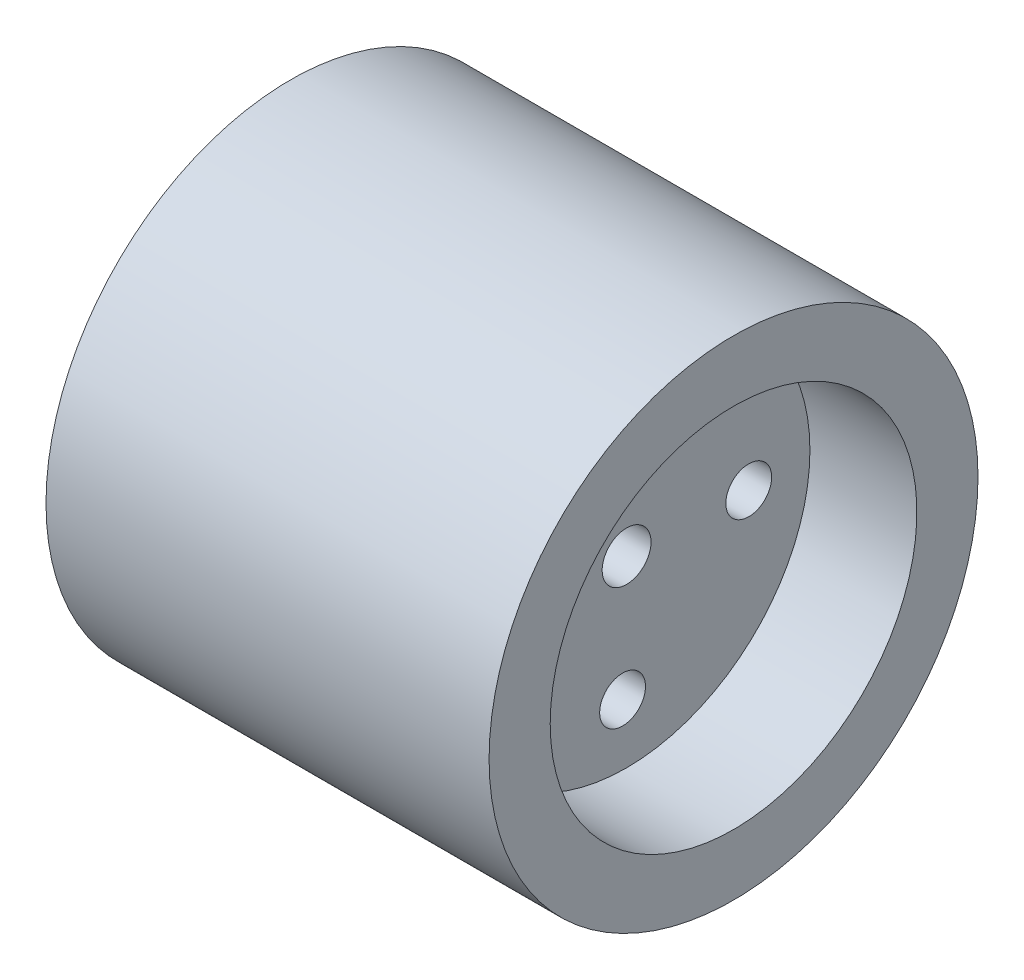
ISO-10303-21;
HEADER;
FILE_DESCRIPTION(('STEP AP214'),'2;1');
FILE_NAME('part.step','',(''),(''),'','','');
FILE_SCHEMA(('AUTOMOTIVE_DESIGN { 1 0 10303 214 1 1 1 1 }'));
ENDSEC;
DATA;
#1=APPLICATION_CONTEXT('core data for automotive mechanical design processes');
#2=APPLICATION_PROTOCOL_DEFINITION('international standard','automotive_design',2000,#1);
#3=PRODUCT_CONTEXT('',#1,'mechanical');
#4=PRODUCT('Part','Part','',(#3));
#5=PRODUCT_RELATED_PRODUCT_CATEGORY('part','',(#4));
#6=PRODUCT_DEFINITION_FORMATION('','',#4);
#7=PRODUCT_DEFINITION_CONTEXT('part definition',#1,'design');
#8=PRODUCT_DEFINITION('design','',#6,#7);
#9=PRODUCT_DEFINITION_SHAPE('','',#8);
#10=(LENGTH_UNIT() NAMED_UNIT(*) SI_UNIT(.MILLI.,.METRE.));
#11=(NAMED_UNIT(*) PLANE_ANGLE_UNIT() SI_UNIT($,.RADIAN.));
#12=(NAMED_UNIT(*) SI_UNIT($,.STERADIAN.) SOLID_ANGLE_UNIT());
#13=UNCERTAINTY_MEASURE_WITH_UNIT(LENGTH_MEASURE(1.E-05),#10,'distance_accuracy_value','');
#14=(GEOMETRIC_REPRESENTATION_CONTEXT(3) GLOBAL_UNCERTAINTY_ASSIGNED_CONTEXT((#13)) GLOBAL_UNIT_ASSIGNED_CONTEXT((#10,
#11,#12)) REPRESENTATION_CONTEXT('',''));
#15=CARTESIAN_POINT('',(0.,0.,0.));
#16=DIRECTION('',(0.,0.,1.));
#17=DIRECTION('',(1.,0.,0.));
#18=AXIS2_PLACEMENT_3D('',#15,#16,#17);
#19=CARTESIAN_POINT('',(-7.,13.,0.));
#20=DIRECTION('',(1.,0.,0.));
#21=DIRECTION('',(0.,0.,-1.));
#22=AXIS2_PLACEMENT_3D('',#19,#20,#21);
#23=PLANE('',#22);
#24=CARTESIAN_POINT('',(-7.,-7.99568996871481,0.262567942051866));
#25=DIRECTION('',(-1.,0.,0.));
#26=DIRECTION('',(0.,0.,1.));
#27=AXIS2_PLACEMENT_3D('',#24,#25,#26);
#28=CIRCLE('',#27,1.5);
#29=CARTESIAN_POINT('',(-7.,-7.99568996871481,1.76256794205187));
#30=VERTEX_POINT('',#29);
#31=EDGE_CURVE('E54',#30,#30,#28,.T.);
#32=ORIENTED_EDGE('',*,*,#31,.F.);
#33=EDGE_LOOP('',(#32));
#34=FACE_BOUND('',#33,.T.);
#35=CARTESIAN_POINT('',(-7.,-0.262567942051867,-7.99568996871481));
#36=DIRECTION('',(-1.,0.,0.));
#37=DIRECTION('',(0.,0.,1.));
#38=AXIS2_PLACEMENT_3D('',#35,#36,#37);
#39=CIRCLE('',#38,1.5);
#40=CARTESIAN_POINT('',(-7.,-0.262567942051867,-6.49568996871481));
#41=VERTEX_POINT('',#40);
#42=EDGE_CURVE('E62',#41,#41,#39,.T.);
#43=ORIENTED_EDGE('',*,*,#42,.F.);
#44=EDGE_LOOP('',(#43));
#45=FACE_BOUND('',#44,.T.);
#46=CARTESIAN_POINT('',(-7.,7.99568996871481,-0.262567942051867));
#47=DIRECTION('',(-1.,0.,0.));
#48=DIRECTION('',(0.,0.,1.));
#49=AXIS2_PLACEMENT_3D('',#46,#47,#48);
#50=CIRCLE('',#49,1.5);
#51=CARTESIAN_POINT('',(-7.,7.99568996871481,1.23743205794813));
#52=VERTEX_POINT('',#51);
#53=EDGE_CURVE('E58',#52,#52,#50,.T.);
#54=ORIENTED_EDGE('',*,*,#53,.F.);
#55=EDGE_LOOP('',(#54));
#56=FACE_BOUND('',#55,.T.);
#57=CARTESIAN_POINT('',(-7.,0.262567942051866,7.99568996871481));
#58=DIRECTION('',(-1.,0.,0.));
#59=DIRECTION('',(0.,0.,1.));
#60=AXIS2_PLACEMENT_3D('',#57,#58,#59);
#61=CIRCLE('',#60,1.5);
#62=CARTESIAN_POINT('',(-7.,0.262567942051866,9.49568996871481));
#63=VERTEX_POINT('',#62);
#64=EDGE_CURVE('E55',#63,#63,#61,.T.);
#65=ORIENTED_EDGE('',*,*,#64,.F.);
#66=EDGE_LOOP('',(#65));
#67=FACE_BOUND('',#66,.T.);
#68=CARTESIAN_POINT('',(-7.,0.,0.));
#69=DIRECTION('',(-1.,0.,0.));
#70=DIRECTION('',(0.,0.,1.));
#71=AXIS2_PLACEMENT_3D('',#68,#69,#70);
#72=CIRCLE('',#71,1.6);
#73=CARTESIAN_POINT('',(-7.,0.,1.6));
#74=VERTEX_POINT('',#73);
#75=EDGE_CURVE('E10',#74,#74,#72,.T.);
#76=ORIENTED_EDGE('',*,*,#75,.F.);
#77=EDGE_LOOP('',(#76));
#78=FACE_BOUND('',#77,.T.);
#79=CARTESIAN_POINT('',(-7.,0.,0.));
#80=DIRECTION('',(-1.,0.,0.));
#81=DIRECTION('',(0.,0.,1.));
#82=AXIS2_PLACEMENT_3D('',#79,#80,#81);
#83=CIRCLE('',#82,13.);
#84=CARTESIAN_POINT('',(-7.,0.,13.));
#85=VERTEX_POINT('',#84);
#86=EDGE_CURVE('E51',#85,#85,#83,.T.);
#87=ORIENTED_EDGE('',*,*,#86,.T.);
#88=EDGE_LOOP('',(#87));
#89=FACE_BOUND('',#88,.T.);
#90=ADVANCED_FACE('F35',(#34,#45,#56,#67,#78,#89),#23,.F.);
#91=CARTESIAN_POINT('',(0.,0.,0.));
#92=DIRECTION('',(-1.,0.,0.));
#93=DIRECTION('',(0.,0.,1.));
#94=AXIS2_PLACEMENT_3D('',#91,#92,#93);
#95=CYLINDRICAL_SURFACE('',#94,1.6);
#96=ORIENTED_EDGE('',*,*,#75,.T.);
#97=EDGE_LOOP('',(#96));
#98=FACE_BOUND('',#97,.T.);
#99=CARTESIAN_POINT('',(8.,0.,0.));
#100=DIRECTION('',(1.,0.,0.));
#101=DIRECTION('',(0.,0.,-1.));
#102=AXIS2_PLACEMENT_3D('',#99,#100,#101);
#103=CIRCLE('',#102,1.6);
#104=CARTESIAN_POINT('',(8.,0.,-1.6));
#105=VERTEX_POINT('',#104);
#106=EDGE_CURVE('E81',#105,#105,#103,.T.);
#107=ORIENTED_EDGE('',*,*,#106,.T.);
#108=EDGE_LOOP('',(#107));
#109=FACE_BOUND('',#108,.T.);
#110=ADVANCED_FACE('F106',(#98,#109),#95,.F.);
#111=CARTESIAN_POINT('',(0.,0.,0.));
#112=DIRECTION('',(-1.,0.,0.));
#113=DIRECTION('',(0.,0.,1.));
#114=AXIS2_PLACEMENT_3D('',#111,#112,#113);
#115=CYLINDRICAL_SURFACE('',#114,12.);
#116=CARTESIAN_POINT('',(8.,0.,0.));
#117=DIRECTION('',(1.,0.,0.));
#118=DIRECTION('',(0.,0.,-1.));
#119=AXIS2_PLACEMENT_3D('',#116,#117,#118);
#120=CIRCLE('',#119,12.);
#121=CARTESIAN_POINT('',(8.,0.,-12.));
#122=VERTEX_POINT('',#121);
#123=EDGE_CURVE('E59',#122,#122,#120,.T.);
#124=ORIENTED_EDGE('',*,*,#123,.F.);
#125=EDGE_LOOP('',(#124));
#126=FACE_BOUND('',#125,.T.);
#127=CARTESIAN_POINT('',(15.,0.,0.));
#128=DIRECTION('',(-1.,0.,0.));
#129=DIRECTION('',(0.,0.,1.));
#130=AXIS2_PLACEMENT_3D('',#127,#128,#129);
#131=CIRCLE('',#130,12.);
#132=CARTESIAN_POINT('',(15.,0.,12.));
#133=VERTEX_POINT('',#132);
#134=EDGE_CURVE('E42',#133,#133,#131,.T.);
#135=ORIENTED_EDGE('',*,*,#134,.F.);
#136=EDGE_LOOP('',(#135));
#137=FACE_BOUND('',#136,.T.);
#138=ADVANCED_FACE('F113',(#126,#137),#115,.F.);
#139=CARTESIAN_POINT('',(15.,12.,0.));
#140=DIRECTION('',(-1.,0.,0.));
#141=DIRECTION('',(0.,0.,1.));
#142=AXIS2_PLACEMENT_3D('',#139,#140,#141);
#143=PLANE('',#142);
#144=CARTESIAN_POINT('',(15.,0.,0.));
#145=DIRECTION('',(-1.,0.,0.));
#146=DIRECTION('',(0.,0.,1.));
#147=AXIS2_PLACEMENT_3D('',#144,#145,#146);
#148=CIRCLE('',#147,16.);
#149=CARTESIAN_POINT('',(15.,0.,16.));
#150=VERTEX_POINT('',#149);
#151=EDGE_CURVE('E46',#150,#150,#148,.T.);
#152=ORIENTED_EDGE('',*,*,#151,.F.);
#153=EDGE_LOOP('',(#152));
#154=FACE_BOUND('',#153,.T.);
#155=ORIENTED_EDGE('',*,*,#134,.T.);
#156=EDGE_LOOP('',(#155));
#157=FACE_BOUND('',#156,.T.);
#158=ADVANCED_FACE('F136',(#154,#157),#143,.F.);
#159=CARTESIAN_POINT('',(0.,0.,0.));
#160=DIRECTION('',(-1.,0.,0.));
#161=DIRECTION('',(0.,0.,1.));
#162=AXIS2_PLACEMENT_3D('',#159,#160,#161);
#163=CYLINDRICAL_SURFACE('',#162,16.);
#164=CARTESIAN_POINT('',(-14.,0.,0.));
#165=DIRECTION('',(1.,0.,0.));
#166=DIRECTION('',(0.,0.,-1.));
#167=AXIS2_PLACEMENT_3D('',#164,#165,#166);
#168=CIRCLE('',#167,16.);
#169=CARTESIAN_POINT('',(-14.,0.,-16.));
#170=VERTEX_POINT('',#169);
#171=EDGE_CURVE('E84',#170,#170,#168,.T.);
#172=ORIENTED_EDGE('',*,*,#171,.T.);
#173=EDGE_LOOP('',(#172));
#174=FACE_BOUND('',#173,.T.);
#175=ORIENTED_EDGE('',*,*,#151,.T.);
#176=EDGE_LOOP('',(#175));
#177=FACE_BOUND('',#176,.T.);
#178=ADVANCED_FACE('F126',(#174,#177),#163,.T.);
#179=CARTESIAN_POINT('',(0.,0.,0.));
#180=DIRECTION('',(-1.,0.,0.));
#181=DIRECTION('',(0.,0.,1.));
#182=AXIS2_PLACEMENT_3D('',#179,#180,#181);
#183=CYLINDRICAL_SURFACE('',#182,13.);
#184=CARTESIAN_POINT('',(-14.,0.,0.));
#185=DIRECTION('',(1.,0.,0.));
#186=DIRECTION('',(0.,0.,-1.));
#187=AXIS2_PLACEMENT_3D('',#184,#185,#186);
#188=CIRCLE('',#187,13.);
#189=CARTESIAN_POINT('',(-14.,0.,-13.));
#190=VERTEX_POINT('',#189);
#191=EDGE_CURVE('E38',#190,#190,#188,.F.);
#192=ORIENTED_EDGE('',*,*,#191,.T.);
#193=EDGE_LOOP('',(#192));
#194=FACE_BOUND('',#193,.T.);
#195=ORIENTED_EDGE('',*,*,#86,.F.);
#196=EDGE_LOOP('',(#195));
#197=FACE_BOUND('',#196,.T.);
#198=ADVANCED_FACE('F91',(#194,#197),#183,.F.);
#199=CARTESIAN_POINT('',(10.,0.262567942051866,7.99568996871481));
#200=DIRECTION('',(-1.,0.,0.));
#201=DIRECTION('',(0.,0.,1.));
#202=AXIS2_PLACEMENT_3D('',#199,#200,#201);
#203=CYLINDRICAL_SURFACE('',#202,1.5);
#204=ORIENTED_EDGE('',*,*,#64,.T.);
#205=EDGE_LOOP('',(#204));
#206=FACE_BOUND('',#205,.T.);
#207=CARTESIAN_POINT('',(8.,0.262567942051866,7.99568996871481));
#208=DIRECTION('',(1.,0.,0.));
#209=DIRECTION('',(0.,0.,-1.));
#210=AXIS2_PLACEMENT_3D('',#207,#208,#209);
#211=CIRCLE('',#210,1.5);
#212=CARTESIAN_POINT('',(8.,0.262567942051866,6.49568996871481));
#213=VERTEX_POINT('',#212);
#214=EDGE_CURVE('E75',#213,#213,#211,.T.);
#215=ORIENTED_EDGE('',*,*,#214,.T.);
#216=EDGE_LOOP('',(#215));
#217=FACE_BOUND('',#216,.T.);
#218=ADVANCED_FACE('F125',(#206,#217),#203,.F.);
#219=CARTESIAN_POINT('',(10.,7.99568996871481,-0.262567942051867));
#220=DIRECTION('',(-1.,0.,0.));
#221=DIRECTION('',(0.,0.,1.));
#222=AXIS2_PLACEMENT_3D('',#219,#220,#221);
#223=CYLINDRICAL_SURFACE('',#222,1.5);
#224=ORIENTED_EDGE('',*,*,#53,.T.);
#225=EDGE_LOOP('',(#224));
#226=FACE_BOUND('',#225,.T.);
#227=CARTESIAN_POINT('',(8.,7.99568996871481,-0.262567942051867));
#228=DIRECTION('',(1.,0.,0.));
#229=DIRECTION('',(0.,0.,-1.));
#230=AXIS2_PLACEMENT_3D('',#227,#228,#229);
#231=CIRCLE('',#230,1.5);
#232=CARTESIAN_POINT('',(8.,7.99568996871481,-1.76256794205187));
#233=VERTEX_POINT('',#232);
#234=EDGE_CURVE('E78',#233,#233,#231,.T.);
#235=ORIENTED_EDGE('',*,*,#234,.T.);
#236=EDGE_LOOP('',(#235));
#237=FACE_BOUND('',#236,.T.);
#238=ADVANCED_FACE('F132',(#226,#237),#223,.F.);
#239=CARTESIAN_POINT('',(10.,-0.262567942051867,-7.99568996871481));
#240=DIRECTION('',(-1.,0.,0.));
#241=DIRECTION('',(0.,0.,1.));
#242=AXIS2_PLACEMENT_3D('',#239,#240,#241);
#243=CYLINDRICAL_SURFACE('',#242,1.5);
#244=ORIENTED_EDGE('',*,*,#42,.T.);
#245=EDGE_LOOP('',(#244));
#246=FACE_BOUND('',#245,.T.);
#247=CARTESIAN_POINT('',(8.,-0.262567942051867,-7.99568996871481));
#248=DIRECTION('',(1.,0.,0.));
#249=DIRECTION('',(0.,0.,-1.));
#250=AXIS2_PLACEMENT_3D('',#247,#248,#249);
#251=CIRCLE('',#250,1.5);
#252=CARTESIAN_POINT('',(8.,-0.262567942051867,-9.49568996871482));
#253=VERTEX_POINT('',#252);
#254=EDGE_CURVE('E69',#253,#253,#251,.T.);
#255=ORIENTED_EDGE('',*,*,#254,.T.);
#256=EDGE_LOOP('',(#255));
#257=FACE_BOUND('',#256,.T.);
#258=ADVANCED_FACE('F162',(#246,#257),#243,.F.);
#259=CARTESIAN_POINT('',(10.,-7.99568996871481,0.262567942051866));
#260=DIRECTION('',(-1.,0.,0.));
#261=DIRECTION('',(0.,0.,1.));
#262=AXIS2_PLACEMENT_3D('',#259,#260,#261);
#263=CYLINDRICAL_SURFACE('',#262,1.5);
#264=ORIENTED_EDGE('',*,*,#31,.T.);
#265=EDGE_LOOP('',(#264));
#266=FACE_BOUND('',#265,.T.);
#267=CARTESIAN_POINT('',(8.,-7.99568996871481,0.262567942051866));
#268=DIRECTION('',(1.,0.,0.));
#269=DIRECTION('',(0.,0.,-1.));
#270=AXIS2_PLACEMENT_3D('',#267,#268,#269);
#271=CIRCLE('',#270,1.5);
#272=CARTESIAN_POINT('',(8.,-7.99568996871481,-1.23743205794813));
#273=VERTEX_POINT('',#272);
#274=EDGE_CURVE('E72',#273,#273,#271,.T.);
#275=ORIENTED_EDGE('',*,*,#274,.T.);
#276=EDGE_LOOP('',(#275));
#277=FACE_BOUND('',#276,.T.);
#278=ADVANCED_FACE('F102',(#266,#277),#263,.F.);
#279=CARTESIAN_POINT('',(8.,0.,0.));
#280=DIRECTION('',(1.,0.,0.));
#281=DIRECTION('',(0.,0.,-1.));
#282=AXIS2_PLACEMENT_3D('',#279,#280,#281);
#283=PLANE('',#282);
#284=ORIENTED_EDGE('',*,*,#234,.F.);
#285=EDGE_LOOP('',(#284));
#286=FACE_BOUND('',#285,.T.);
#287=ORIENTED_EDGE('',*,*,#274,.F.);
#288=EDGE_LOOP('',(#287));
#289=FACE_BOUND('',#288,.T.);
#290=ORIENTED_EDGE('',*,*,#123,.T.);
#291=EDGE_LOOP('',(#290));
#292=FACE_BOUND('',#291,.T.);
#293=ORIENTED_EDGE('',*,*,#254,.F.);
#294=EDGE_LOOP('',(#293));
#295=FACE_BOUND('',#294,.T.);
#296=ORIENTED_EDGE('',*,*,#214,.F.);
#297=EDGE_LOOP('',(#296));
#298=FACE_BOUND('',#297,.T.);
#299=ORIENTED_EDGE('',*,*,#106,.F.);
#300=EDGE_LOOP('',(#299));
#301=FACE_BOUND('',#300,.T.);
#302=ADVANCED_FACE('F97',(#286,#289,#292,#295,#298,#301),#283,.T.);
#303=CARTESIAN_POINT('',(-14.,-18.,-18.));
#304=DIRECTION('',(1.,0.,0.));
#305=DIRECTION('',(0.,0.,-1.));
#306=AXIS2_PLACEMENT_3D('',#303,#304,#305);
#307=PLANE('',#306);
#308=ORIENTED_EDGE('',*,*,#191,.F.);
#309=EDGE_LOOP('',(#308));
#310=FACE_BOUND('',#309,.T.);
#311=ORIENTED_EDGE('',*,*,#171,.F.);
#312=EDGE_LOOP('',(#311));
#313=FACE_BOUND('',#312,.T.);
#314=ADVANCED_FACE('F94',(#310,#313),#307,.F.);
#315=CLOSED_SHELL('',(#90,#110,#138,#158,#178,#198,#218,#238,#258,#278,#302,#314));
#316=MANIFOLD_SOLID_BREP('B2',#315);
#317=ADVANCED_BREP_SHAPE_REPRESENTATION('',(#18,#316),#14);
#318=SHAPE_DEFINITION_REPRESENTATION(#9,#317);
ENDSEC;
END-ISO-10303-21;
